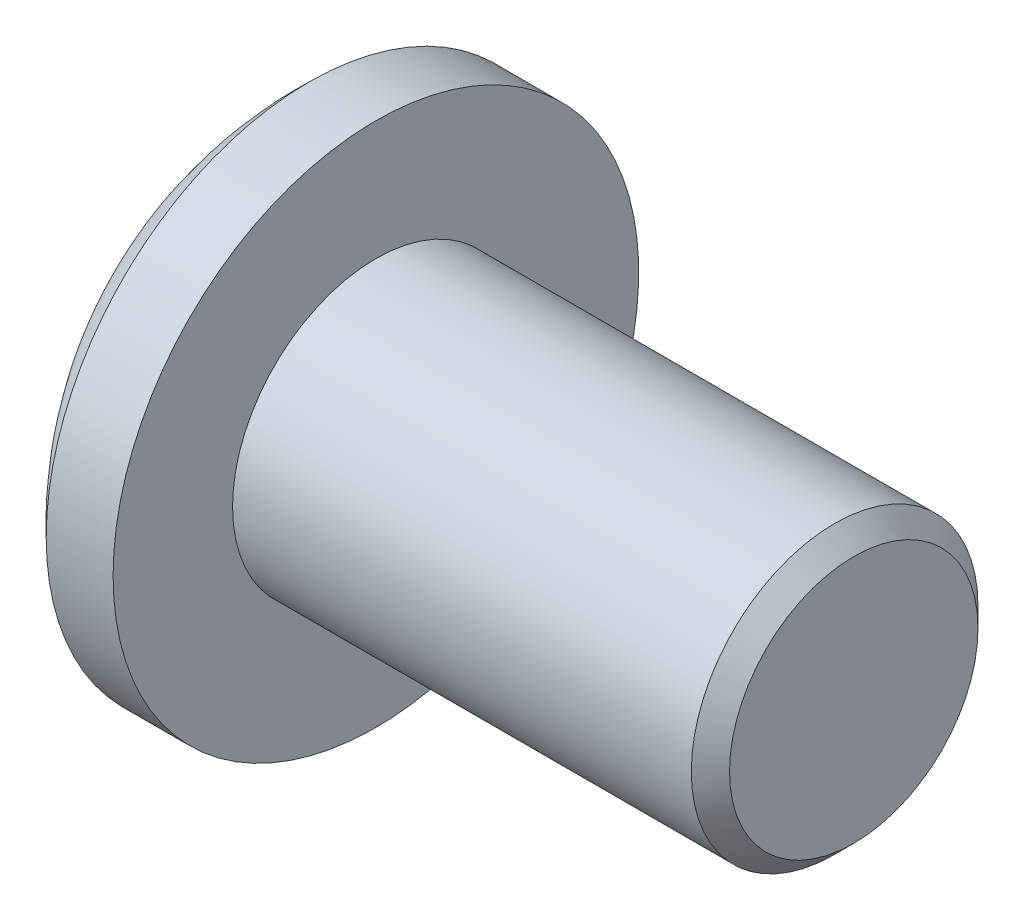
ISO-10303-21;
HEADER;
FILE_DESCRIPTION(('STEP AP214'),'2;1');
FILE_NAME('part.step','',(''),(''),'','','');
FILE_SCHEMA(('AUTOMOTIVE_DESIGN { 1 0 10303 214 1 1 1 1 }'));
ENDSEC;
DATA;
#1=APPLICATION_CONTEXT('core data for automotive mechanical design processes');
#2=APPLICATION_PROTOCOL_DEFINITION('international standard','automotive_design',2000,#1);
#3=PRODUCT_CONTEXT('',#1,'mechanical');
#4=PRODUCT('Part','Part','',(#3));
#5=PRODUCT_RELATED_PRODUCT_CATEGORY('part','',(#4));
#6=PRODUCT_DEFINITION_FORMATION('','',#4);
#7=PRODUCT_DEFINITION_CONTEXT('part definition',#1,'design');
#8=PRODUCT_DEFINITION('design','',#6,#7);
#9=PRODUCT_DEFINITION_SHAPE('','',#8);
#10=(LENGTH_UNIT() NAMED_UNIT(*) SI_UNIT(.MILLI.,.METRE.));
#11=(NAMED_UNIT(*) PLANE_ANGLE_UNIT() SI_UNIT($,.RADIAN.));
#12=(NAMED_UNIT(*) SI_UNIT($,.STERADIAN.) SOLID_ANGLE_UNIT());
#13=UNCERTAINTY_MEASURE_WITH_UNIT(LENGTH_MEASURE(1.E-05),#10,'distance_accuracy_value','');
#14=(GEOMETRIC_REPRESENTATION_CONTEXT(3) GLOBAL_UNCERTAINTY_ASSIGNED_CONTEXT((#13)) GLOBAL_UNIT_ASSIGNED_CONTEXT((#10,
#11,#12)) REPRESENTATION_CONTEXT('',''));
#15=CARTESIAN_POINT('',(0.,0.,0.));
#16=DIRECTION('',(0.,0.,1.));
#17=DIRECTION('',(1.,0.,0.));
#18=AXIS2_PLACEMENT_3D('',#15,#16,#17);
#19=CARTESIAN_POINT('',(0.,-0.35,0.35));
#20=DIRECTION('',(0.,-1.,0.));
#21=DIRECTION('',(0.,0.,-1.));
#22=AXIS2_PLACEMENT_3D('',#19,#20,#21);
#23=PLANE('',#22);
#24=CARTESIAN_POINT('',(1.31249982500017,-0.35,-0.000700000000000016));
#25=CARTESIAN_POINT('',(1.312556426158,-0.35,0.0291901757612279));
#26=CARTESIAN_POINT('',(1.31156711794547,-0.35,0.0590578749210361));
#27=CARTESIAN_POINT('',(1.30788247590197,-0.35,0.118636495399669));
#28=CARTESIAN_POINT('',(1.30519027348892,-0.35,0.148347603766359));
#29=CARTESIAN_POINT('',(1.29848919725521,-0.35,0.207556817473034));
#30=CARTESIAN_POINT('',(1.29448275105337,-0.35,0.237055213822397));
#31=CARTESIAN_POINT('',(1.28556389890639,-0.35,0.295928476326227));
#32=CARTESIAN_POINT('',(1.28065098534136,-0.35,0.32530326378573));
#33=CARTESIAN_POINT('',(1.26688604982366,-0.35,0.402698447303763));
#34=CARTESIAN_POINT('',(1.25752450056769,-0.35,0.450626795751266));
#35=CARTESIAN_POINT('',(1.23793898297709,-0.35,0.546308423997289));
#36=CARTESIAN_POINT('',(1.22771490332547,-0.35,0.594061680366267));
#37=CARTESIAN_POINT('',(1.19631892095972,-0.35,0.73717436804379));
#38=CARTESIAN_POINT('',(1.17442567862429,-0.35,0.8323745983494));
#39=CARTESIAN_POINT('',(1.12977441097477,-0.35,1.02317917286398));
#40=CARTESIAN_POINT('',(1.1070119333935,-0.35,1.11878245021183));
#41=CARTESIAN_POINT('',(1.07258702934453,-0.35,1.26208635516026));
#42=CARTESIAN_POINT('',(1.06106910824491,-0.35,1.30982148942342));
#43=CARTESIAN_POINT('',(1.03796108921691,-0.35,1.40527309922879));
#44=CARTESIAN_POINT('',(1.02637099299731,-0.35,1.45298957518453));
#45=CARTESIAN_POINT('',(1.01475653071726,-0.35,1.5007));
#46=B_SPLINE_CURVE_WITH_KNOTS('',3,(#24,#25,#26,#27,#28,#29,#30,#31,#32,#33,#34,#35,#36,#37,#38,
#39,#40,#41,#42,#43,#44,#45),.UNSPECIFIED.,.F.,.F.,(4,2,2,2,2,2,2,2,2,2,4),(0.,
0.0896175477774821,0.17907077684473,0.268359693248504,0.357698763866894,0.504183356378906,
0.650686883000155,0.943730994699917,1.2385586269609,1.38587362377094,1.53318514597955),.UNSPECIFIED.);
#47=CARTESIAN_POINT('',(1.27625631329236,-0.350000000000002,0.35));
#48=VERTEX_POINT('',#47);
#49=CARTESIAN_POINT('',(1.01492695498127,-0.35,1.5));
#50=VERTEX_POINT('',#49);
#51=EDGE_CURVE('E151',#48,#50,#46,.T.);
#52=ORIENTED_EDGE('',*,*,#51,.F.);
#53=DIRECTION('',(1.,0.,0.));
#54=VECTOR('',#53,1.);
#55=CARTESIAN_POINT('',(0.,-0.35,0.35));
#56=LINE('',#55,#54);
#57=CARTESIAN_POINT('',(0.032801009437841,-0.35,0.35));
#58=VERTEX_POINT('',#57);
#59=EDGE_CURVE('E258',#58,#48,#56,.T.);
#60=ORIENTED_EDGE('',*,*,#59,.F.);
#61=CARTESIAN_POINT('',(3.75104166666667,-0.35,0.));
#62=DIRECTION('',(0.,-1.,0.));
#63=DIRECTION('',(0.,0.,-1.));
#64=AXIS2_PLACEMENT_3D('',#61,#62,#63);
#65=CIRCLE('',#64,3.73467717280483);
#66=CARTESIAN_POINT('',(0.330835008426634,-0.35,1.5));
#67=VERTEX_POINT('',#66);
#68=EDGE_CURVE('E156',#67,#58,#65,.T.);
#69=ORIENTED_EDGE('',*,*,#68,.F.);
#70=DIRECTION('',(1.,0.,0.));
#71=VECTOR('',#70,1.);
#72=CARTESIAN_POINT('',(0.,-0.35,1.5));
#73=LINE('',#72,#71);
#74=EDGE_CURVE('E259',#67,#50,#73,.T.);
#75=ORIENTED_EDGE('',*,*,#74,.T.);
#76=EDGE_LOOP('',(#52,#60,#69,#75));
#77=FACE_BOUND('',#76,.T.);
#78=ADVANCED_FACE('F47',(#77),#23,.F.);
#79=CARTESIAN_POINT('',(0.,0.35,1.5));
#80=DIRECTION('',(0.,0.,1.));
#81=DIRECTION('',(1.,0.,0.));
#82=AXIS2_PLACEMENT_3D('',#79,#80,#81);
#83=PLANE('',#82);
#84=CARTESIAN_POINT('',(0.918132091381384,-1.21043252670426,1.5));
#85=CARTESIAN_POINT('',(0.930973543389138,-1.12856624331021,1.5));
#86=CARTESIAN_POINT('',(0.943068686502294,-1.04657060736441,1.5));
#87=CARTESIAN_POINT('',(0.965288556160192,-0.882270742182961,1.5));
#88=CARTESIAN_POINT('',(0.975412241366021,-0.799966373139374,1.5));
#89=CARTESIAN_POINT('',(0.993194036961851,-0.635111443336779,1.5));
#90=CARTESIAN_POINT('',(1.00085292549315,-0.552560968596644,1.5));
#91=CARTESIAN_POINT('',(1.01320708777964,-0.387240396022244,1.5));
#92=CARTESIAN_POINT('',(1.01790260324994,-0.304470316653786,1.5));
#93=CARTESIAN_POINT('',(1.02392263085181,-0.13967449866055,1.5));
#94=CARTESIAN_POINT('',(1.02528205273462,-0.0576500795542946,1.5));
#95=CARTESIAN_POINT('',(1.02461898626684,0.106386337497374,1.5));
#96=CARTESIAN_POINT('',(1.0225962945847,0.188398334399515,1.5));
#97=CARTESIAN_POINT('',(1.01168631710467,0.434137114600856,1.5));
#98=CARTESIAN_POINT('',(0.997960422545781,0.59766265669097,1.5));
#99=CARTESIAN_POINT('',(0.975303847621362,0.798130172100281,1.5));
#100=CARTESIAN_POINT('',(0.970810416971451,0.835652465096373,1.5));
#101=CARTESIAN_POINT('',(0.961378543942815,0.910639605057487,1.5));
#102=CARTESIAN_POINT('',(0.956440143534299,0.948104457102122,1.5));
#103=CARTESIAN_POINT('',(0.946148471494111,1.02307669175514,1.5));
#104=CARTESIAN_POINT('',(0.940794143495476,1.06058392731102,1.5));
#105=CARTESIAN_POINT('',(0.929723819718766,1.13554669433303,1.5));
#106=CARTESIAN_POINT('',(0.924007808483072,1.17300222351934,1.5));
#107=CARTESIAN_POINT('',(0.918132091381384,1.21043252670426,1.5));
#108=B_SPLINE_CURVE_WITH_KNOTS('',3,(#84,#85,#86,#87,#88,#89,#90,#91,#92,#93,#94,#95,#96,#97,
#98,#99,#100,#101,#102,#103,#104,#105,#106,#107),.UNSPECIFIED.,.F.,.F.,(4,2,2,2,2,2,2,2,2,2,2,
4),(0.,0.248616833237539,0.497364633665986,0.746033826698071,0.994682733768993,1.24071840364819,
1.48676886564296,1.9785825704132,2.09195618147225,2.20531911013537,2.31898001250494,
2.43264577579994),.UNSPECIFIED.);
#109=CARTESIAN_POINT('',(1.01492695498127,0.35,1.5));
#110=VERTEX_POINT('',#109);
#111=EDGE_CURVE('E63',#50,#110,#108,.T.);
#112=ORIENTED_EDGE('',*,*,#111,.F.);
#113=ORIENTED_EDGE('',*,*,#74,.F.);
#114=CARTESIAN_POINT('',(3.75104166666667,0.,1.5));
#115=DIRECTION('',(0.,0.,1.));
#116=DIRECTION('',(1.,0.,0.));
#117=AXIS2_PLACEMENT_3D('',#114,#115,#116);
#118=CIRCLE('',#117,3.43806829267097);
#119=CARTESIAN_POINT('',(0.330835008426634,0.35,1.5));
#120=VERTEX_POINT('',#119);
#121=EDGE_CURVE('E160',#120,#67,#118,.T.);
#122=ORIENTED_EDGE('',*,*,#121,.F.);
#123=DIRECTION('',(1.,0.,0.));
#124=VECTOR('',#123,1.);
#125=CARTESIAN_POINT('',(0.,0.35,1.5));
#126=LINE('',#125,#124);
#127=EDGE_CURVE('E297',#120,#110,#126,.T.);
#128=ORIENTED_EDGE('',*,*,#127,.T.);
#129=EDGE_LOOP('',(#112,#113,#122,#128));
#130=FACE_BOUND('',#129,.T.);
#131=ADVANCED_FACE('F174',(#130),#83,.F.);
#132=CARTESIAN_POINT('',(0.,0.35,0.35));
#133=DIRECTION('',(0.,1.,0.));
#134=DIRECTION('',(0.,0.,1.));
#135=AXIS2_PLACEMENT_3D('',#132,#133,#134);
#136=PLANE('',#135);
#137=CARTESIAN_POINT('',(1.01475653071726,0.35,1.5007));
#138=CARTESIAN_POINT('',(1.02984716381327,0.35,1.43869578309974));
#139=CARTESIAN_POINT('',(1.04490160914381,0.35,1.37668257615653));
#140=CARTESIAN_POINT('',(1.07487027517525,0.35,1.25264521214329));
#141=CARTESIAN_POINT('',(1.08978454296807,0.35,1.19062106644276));
#142=CARTESIAN_POINT('',(1.1193943761448,0.35,1.06661458848605));
#143=CARTESIAN_POINT('',(1.13409022448873,0.35,1.0046323238207));
#144=CARTESIAN_POINT('',(1.16316789341244,0.35,0.880570690843416));
#145=CARTESIAN_POINT('',(1.17754960250324,0.35,0.818491296174657));
#146=CARTESIAN_POINT('',(1.20578818411991,0.35,0.694029251182321));
#147=CARTESIAN_POINT('',(1.21964346027031,0.35,0.631646239510792));
#148=CARTESIAN_POINT('',(1.24627006810862,0.35,0.50669477744741));
#149=CARTESIAN_POINT('',(1.25904229607583,0.35,0.444126525622878));
#150=CARTESIAN_POINT('',(1.27639488909775,0.35,0.349839067986749));
#151=CARTESIAN_POINT('',(1.28188491971625,0.35,0.318290316131966));
#152=CARTESIAN_POINT('',(1.29190679538392,0.35,0.255053387681539));
#153=CARTESIAN_POINT('',(1.29643910699191,0.35,0.223365286686852));
#154=CARTESIAN_POINT('',(1.30406988834714,0.35,0.159709749626414));
#155=CARTESIAN_POINT('',(1.30716404858206,0.35,0.127741762767393));
#156=CARTESIAN_POINT('',(1.31141420028799,0.35,0.0636263192839079));
#157=CARTESIAN_POINT('',(1.3125668153707,0.35,0.0314786473573614));
#158=CARTESIAN_POINT('',(1.31249982500017,0.35,-0.000700000000000052));
#159=B_SPLINE_CURVE_WITH_KNOTS('',3,(#137,#138,#139,#140,#141,#142,#143,#144,#145,#146,#147,
#148,#149,#150,#151,#152,#153,#154,#155,#156,#157,#158),.UNSPECIFIED.,.F.,.F.,(4,2,2,2,2,2,2,2,
2,2,4),(0.,0.191442834244982,0.382818873885242,0.573920469621334,0.765088820705008,
0.956796887132839,1.14834472444967,1.24440382635218,1.3404160240232,1.43671410241299,
1.53317947297478),.UNSPECIFIED.);
#160=CARTESIAN_POINT('',(1.27625631329235,0.35,0.35));
#161=VERTEX_POINT('',#160);
#162=EDGE_CURVE('E71',#110,#161,#159,.T.);
#163=ORIENTED_EDGE('',*,*,#162,.F.);
#164=ORIENTED_EDGE('',*,*,#127,.F.);
#165=CARTESIAN_POINT('',(3.75104166666667,0.35,0.));
#166=DIRECTION('',(0.,1.,0.));
#167=DIRECTION('',(0.,0.,1.));
#168=AXIS2_PLACEMENT_3D('',#165,#166,#167);
#169=CIRCLE('',#168,3.73467717280483);
#170=CARTESIAN_POINT('',(0.032801009437841,0.35,0.35));
#171=VERTEX_POINT('',#170);
#172=EDGE_CURVE('E330',#171,#120,#169,.T.);
#173=ORIENTED_EDGE('',*,*,#172,.F.);
#174=DIRECTION('',(1.,0.,0.));
#175=VECTOR('',#174,1.);
#176=CARTESIAN_POINT('',(0.,0.35,0.35));
#177=LINE('',#176,#175);
#178=EDGE_CURVE('E333',#171,#161,#177,.T.);
#179=ORIENTED_EDGE('',*,*,#178,.T.);
#180=EDGE_LOOP('',(#163,#164,#173,#179));
#181=FACE_BOUND('',#180,.T.);
#182=ADVANCED_FACE('F332',(#181),#136,.F.);
#183=CARTESIAN_POINT('',(0.,1.5,0.35));
#184=DIRECTION('',(0.,0.,1.));
#185=DIRECTION('',(0.,-1.,0.));
#186=AXIS2_PLACEMENT_3D('',#183,#184,#185);
#187=PLANE('',#186);
#188=CARTESIAN_POINT('',(1.31249982500017,-0.000700000000000033,0.35));
#189=CARTESIAN_POINT('',(1.312556426158,0.0291901757612279,0.35));
#190=CARTESIAN_POINT('',(1.31156711794547,0.0590578749210361,0.35));
#191=CARTESIAN_POINT('',(1.30788247590197,0.118636495399669,0.35));
#192=CARTESIAN_POINT('',(1.30519027348892,0.148347603766359,0.35));
#193=CARTESIAN_POINT('',(1.29848919725521,0.207556817473034,0.35));
#194=CARTESIAN_POINT('',(1.29448275105337,0.237055213822397,0.35));
#195=CARTESIAN_POINT('',(1.28556389890639,0.295928476326227,0.35));
#196=CARTESIAN_POINT('',(1.28065098534136,0.32530326378573,0.35));
#197=CARTESIAN_POINT('',(1.26688604982366,0.402698447303763,0.35));
#198=CARTESIAN_POINT('',(1.25752450056769,0.450626795751266,0.35));
#199=CARTESIAN_POINT('',(1.23793898297709,0.546308423997289,0.35));
#200=CARTESIAN_POINT('',(1.22771490332547,0.594061680366267,0.35));
#201=CARTESIAN_POINT('',(1.19631892095972,0.73717436804379,0.35));
#202=CARTESIAN_POINT('',(1.17442567862429,0.8323745983494,0.35));
#203=CARTESIAN_POINT('',(1.12977441097477,1.02317917286399,0.35));
#204=CARTESIAN_POINT('',(1.1070119333935,1.11878245021183,0.35));
#205=CARTESIAN_POINT('',(1.07258702934453,1.26208635516026,0.35));
#206=CARTESIAN_POINT('',(1.06106910824491,1.30982148942342,0.35));
#207=CARTESIAN_POINT('',(1.03796108921691,1.40527309922879,0.35));
#208=CARTESIAN_POINT('',(1.02637099299731,1.45298957518453,0.35));
#209=CARTESIAN_POINT('',(1.01475653071726,1.5007,0.35));
#210=B_SPLINE_CURVE_WITH_KNOTS('',3,(#188,#189,#190,#191,#192,#193,#194,#195,#196,#197,#198,
#199,#200,#201,#202,#203,#204,#205,#206,#207,#208,#209),.UNSPECIFIED.,.F.,.F.,(4,2,2,2,2,2,2,2,
2,2,4),(0.,0.0896175477774821,0.17907077684473,0.268359693248504,0.357698763866894,
0.504183356378907,0.650686883000156,0.943730994699917,1.2385586269609,1.38587362377094,
1.53318514597955),.UNSPECIFIED.);
#211=CARTESIAN_POINT('',(1.01492695498127,1.5,0.35));
#212=VERTEX_POINT('',#211);
#213=EDGE_CURVE('E237',#161,#212,#210,.T.);
#214=ORIENTED_EDGE('',*,*,#213,.F.);
#215=ORIENTED_EDGE('',*,*,#178,.F.);
#216=CARTESIAN_POINT('',(3.75104166666667,0.,0.35));
#217=DIRECTION('',(0.,0.,1.));
#218=DIRECTION('',(0.,-1.,0.));
#219=AXIS2_PLACEMENT_3D('',#216,#217,#218);
#220=CIRCLE('',#219,3.73467717280483);
#221=CARTESIAN_POINT('',(0.330835008426635,1.5,0.35));
#222=VERTEX_POINT('',#221);
#223=EDGE_CURVE('E327',#222,#171,#220,.T.);
#224=ORIENTED_EDGE('',*,*,#223,.F.);
#225=DIRECTION('',(1.,0.,0.));
#226=VECTOR('',#225,1.);
#227=CARTESIAN_POINT('',(0.,1.5,0.35));
#228=LINE('',#227,#226);
#229=EDGE_CURVE('E339',#222,#212,#228,.T.);
#230=ORIENTED_EDGE('',*,*,#229,.T.);
#231=EDGE_LOOP('',(#214,#215,#224,#230));
#232=FACE_BOUND('',#231,.T.);
#233=ADVANCED_FACE('F335',(#232),#187,.F.);
#234=CARTESIAN_POINT('',(0.,1.5,-0.35));
#235=DIRECTION('',(0.,1.,0.));
#236=DIRECTION('',(0.,0.,1.));
#237=AXIS2_PLACEMENT_3D('',#234,#235,#236);
#238=PLANE('',#237);
#239=CARTESIAN_POINT('',(0.918132091381384,1.5,1.21043252670426));
#240=CARTESIAN_POINT('',(0.930973543389138,1.5,1.12856624331021));
#241=CARTESIAN_POINT('',(0.943068686502294,1.5,1.04657060736441));
#242=CARTESIAN_POINT('',(0.965288556160192,1.5,0.88227074218296));
#243=CARTESIAN_POINT('',(0.975412241366021,1.5,0.799966373139374));
#244=CARTESIAN_POINT('',(0.993194036961851,1.5,0.635111443336779));
#245=CARTESIAN_POINT('',(1.00085292549315,1.5,0.552560968596644));
#246=CARTESIAN_POINT('',(1.01320708777964,1.5,0.387240396022243));
#247=CARTESIAN_POINT('',(1.01790260324994,1.5,0.304470316653786));
#248=CARTESIAN_POINT('',(1.02392263085181,1.5,0.13967449866055));
#249=CARTESIAN_POINT('',(1.02528205273461,1.5,0.0576500795542946));
#250=CARTESIAN_POINT('',(1.02461898626684,1.5,-0.106386337497374));
#251=CARTESIAN_POINT('',(1.0225962945847,1.5,-0.188398334399515));
#252=CARTESIAN_POINT('',(1.01168631710467,1.5,-0.434137114600856));
#253=CARTESIAN_POINT('',(0.997960422545781,1.5,-0.59766265669097));
#254=CARTESIAN_POINT('',(0.975303847621362,1.5,-0.798130172100281));
#255=CARTESIAN_POINT('',(0.970810416971451,1.5,-0.835652465096373));
#256=CARTESIAN_POINT('',(0.961378543942814,1.5,-0.910639605057487));
#257=CARTESIAN_POINT('',(0.956440143534298,1.5,-0.948104457102122));
#258=CARTESIAN_POINT('',(0.94614847149411,1.5,-1.02307669175514));
#259=CARTESIAN_POINT('',(0.940794143495476,1.5,-1.06058392731102));
#260=CARTESIAN_POINT('',(0.929723819718766,1.5,-1.13554669433303));
#261=CARTESIAN_POINT('',(0.924007808483072,1.5,-1.17300222351934));
#262=CARTESIAN_POINT('',(0.918132091381384,1.5,-1.21043252670426));
#263=B_SPLINE_CURVE_WITH_KNOTS('',3,(#239,#240,#241,#242,#243,#244,#245,#246,#247,#248,#249,
#250,#251,#252,#253,#254,#255,#256,#257,#258,#259,#260,#261,#262),.UNSPECIFIED.,.F.,.F.,(4,2,2,
2,2,2,2,2,2,2,2,4),(0.,0.24861683323754,0.497364633665986,0.746033826698072,0.994682733768993,
1.24071840364819,1.48676886564296,1.9785825704132,2.09195618147225,2.20531911013537,
2.31898001250494,2.43264577579994),.UNSPECIFIED.);
#264=CARTESIAN_POINT('',(1.01492695498127,1.5,-0.35));
#265=VERTEX_POINT('',#264);
#266=EDGE_CURVE('E229',#212,#265,#263,.T.);
#267=ORIENTED_EDGE('',*,*,#266,.F.);
#268=ORIENTED_EDGE('',*,*,#229,.F.);
#269=CARTESIAN_POINT('',(3.75104166666667,1.5,0.));
#270=DIRECTION('',(0.,1.,0.));
#271=DIRECTION('',(0.,0.,1.));
#272=AXIS2_PLACEMENT_3D('',#269,#270,#271);
#273=CIRCLE('',#272,3.43806829267096);
#274=CARTESIAN_POINT('',(0.330835008426635,1.5,-0.35));
#275=VERTEX_POINT('',#274);
#276=EDGE_CURVE('E324',#275,#222,#273,.T.);
#277=ORIENTED_EDGE('',*,*,#276,.F.);
#278=DIRECTION('',(1.,0.,0.));
#279=VECTOR('',#278,1.);
#280=CARTESIAN_POINT('',(0.,1.5,-0.35));
#281=LINE('',#280,#279);
#282=EDGE_CURVE('E341',#275,#265,#281,.T.);
#283=ORIENTED_EDGE('',*,*,#282,.T.);
#284=EDGE_LOOP('',(#267,#268,#277,#283));
#285=FACE_BOUND('',#284,.T.);
#286=ADVANCED_FACE('F395',(#285),#238,.F.);
#287=CARTESIAN_POINT('',(0.,1.5,-0.35));
#288=DIRECTION('',(0.,0.,-1.));
#289=DIRECTION('',(0.,1.,0.));
#290=AXIS2_PLACEMENT_3D('',#287,#288,#289);
#291=PLANE('',#290);
#292=CARTESIAN_POINT('',(1.01475653071726,1.5007,-0.35));
#293=CARTESIAN_POINT('',(1.02984716381327,1.43869578309974,-0.35));
#294=CARTESIAN_POINT('',(1.04490160914381,1.37668257615653,-0.35));
#295=CARTESIAN_POINT('',(1.07487027517525,1.25264521214329,-0.35));
#296=CARTESIAN_POINT('',(1.08978454296807,1.19062106644276,-0.35));
#297=CARTESIAN_POINT('',(1.1193943761448,1.06661458848605,-0.35));
#298=CARTESIAN_POINT('',(1.13409022448873,1.0046323238207,-0.35));
#299=CARTESIAN_POINT('',(1.16316789341244,0.880570690843416,-0.35));
#300=CARTESIAN_POINT('',(1.17754960250324,0.818491296174657,-0.35));
#301=CARTESIAN_POINT('',(1.20578818411991,0.694029251182321,-0.35));
#302=CARTESIAN_POINT('',(1.21964346027031,0.631646239510792,-0.35));
#303=CARTESIAN_POINT('',(1.24627006810862,0.50669477744741,-0.35));
#304=CARTESIAN_POINT('',(1.25904229607583,0.444126525622878,-0.35));
#305=CARTESIAN_POINT('',(1.27639488909775,0.349839067986749,-0.35));
#306=CARTESIAN_POINT('',(1.28188491971625,0.318290316131966,-0.35));
#307=CARTESIAN_POINT('',(1.29190679538392,0.255053387681539,-0.35));
#308=CARTESIAN_POINT('',(1.29643910699191,0.223365286686852,-0.35));
#309=CARTESIAN_POINT('',(1.30406988834714,0.159709749626414,-0.35));
#310=CARTESIAN_POINT('',(1.30716404858206,0.127741762767393,-0.35));
#311=CARTESIAN_POINT('',(1.31141420028799,0.0636263192839078,-0.35));
#312=CARTESIAN_POINT('',(1.3125668153707,0.0314786473573612,-0.35));
#313=CARTESIAN_POINT('',(1.31249982500017,-0.000700000000000115,-0.35));
#314=B_SPLINE_CURVE_WITH_KNOTS('',3,(#292,#293,#294,#295,#296,#297,#298,#299,#300,#301,#302,
#303,#304,#305,#306,#307,#308,#309,#310,#311,#312,#313),.UNSPECIFIED.,.F.,.F.,(4,2,2,2,2,2,2,2,
2,2,4),(0.,0.191442834244982,0.382818873885242,0.573920469621334,0.765088820705009,
0.956796887132839,1.14834472444967,1.24440382635218,1.3404160240232,1.43671410241299,
1.53317947297478),.UNSPECIFIED.);
#315=CARTESIAN_POINT('',(1.27625631329235,0.35,-0.35));
#316=VERTEX_POINT('',#315);
#317=EDGE_CURVE('E221',#265,#316,#314,.T.);
#318=ORIENTED_EDGE('',*,*,#317,.F.);
#319=ORIENTED_EDGE('',*,*,#282,.F.);
#320=CARTESIAN_POINT('',(3.75104166666667,0.,-0.35));
#321=DIRECTION('',(0.,0.,-1.));
#322=DIRECTION('',(0.,1.,0.));
#323=AXIS2_PLACEMENT_3D('',#320,#321,#322);
#324=CIRCLE('',#323,3.73467717280482);
#325=CARTESIAN_POINT('',(0.032801009437841,0.35,-0.35));
#326=VERTEX_POINT('',#325);
#327=EDGE_CURVE('E321',#326,#275,#324,.T.);
#328=ORIENTED_EDGE('',*,*,#327,.F.);
#329=DIRECTION('',(1.,0.,0.));
#330=VECTOR('',#329,1.);
#331=CARTESIAN_POINT('',(0.,0.35,-0.35));
#332=LINE('',#331,#330);
#333=EDGE_CURVE('E346',#326,#316,#332,.T.);
#334=ORIENTED_EDGE('',*,*,#333,.T.);
#335=EDGE_LOOP('',(#318,#319,#328,#334));
#336=FACE_BOUND('',#335,.T.);
#337=ADVANCED_FACE('F391',(#336),#291,.F.);
#338=CARTESIAN_POINT('',(0.,0.35,-1.5));
#339=DIRECTION('',(0.,1.,0.));
#340=DIRECTION('',(0.,0.,1.));
#341=AXIS2_PLACEMENT_3D('',#338,#339,#340);
#342=PLANE('',#341);
#343=CARTESIAN_POINT('',(1.31249982500017,0.35,0.000700000000000049));
#344=CARTESIAN_POINT('',(1.312556426158,0.35,-0.0291901757612279));
#345=CARTESIAN_POINT('',(1.31156711794547,0.35,-0.0590578749210361));
#346=CARTESIAN_POINT('',(1.30788247590197,0.35,-0.118636495399669));
#347=CARTESIAN_POINT('',(1.30519027348892,0.35,-0.148347603766359));
#348=CARTESIAN_POINT('',(1.29848919725521,0.35,-0.207556817473034));
#349=CARTESIAN_POINT('',(1.29448275105337,0.35,-0.237055213822397));
#350=CARTESIAN_POINT('',(1.28556389890639,0.35,-0.295928476326227));
#351=CARTESIAN_POINT('',(1.28065098534136,0.35,-0.32530326378573));
#352=CARTESIAN_POINT('',(1.26688604982366,0.35,-0.402698447303763));
#353=CARTESIAN_POINT('',(1.25752450056769,0.35,-0.450626795751266));
#354=CARTESIAN_POINT('',(1.23793898297709,0.35,-0.546308423997289));
#355=CARTESIAN_POINT('',(1.22771490332547,0.35,-0.594061680366268));
#356=CARTESIAN_POINT('',(1.19631892095972,0.35,-0.73717436804379));
#357=CARTESIAN_POINT('',(1.17442567862429,0.35,-0.832374598349401));
#358=CARTESIAN_POINT('',(1.12977441097477,0.35,-1.02317917286399));
#359=CARTESIAN_POINT('',(1.1070119333935,0.35,-1.11878245021183));
#360=CARTESIAN_POINT('',(1.07258702934453,0.35,-1.26208635516027));
#361=CARTESIAN_POINT('',(1.06106910824491,0.35,-1.30982148942343));
#362=CARTESIAN_POINT('',(1.03796108921691,0.35,-1.40527309922879));
#363=CARTESIAN_POINT('',(1.02637099299731,0.35,-1.45298957518453));
#364=CARTESIAN_POINT('',(1.01475653071726,0.35,-1.5007));
#365=B_SPLINE_CURVE_WITH_KNOTS('',3,(#343,#344,#345,#346,#347,#348,#349,#350,#351,#352,#353,
#354,#355,#356,#357,#358,#359,#360,#361,#362,#363,#364),.UNSPECIFIED.,.F.,.F.,(4,2,2,2,2,2,2,2,
2,2,4),(0.,0.0896175477774821,0.17907077684473,0.268359693248504,0.357698763866894,
0.504183356378907,0.650686883000156,0.943730994699918,1.2385586269609,1.38587362377094,
1.53318514597956),.UNSPECIFIED.);
#366=CARTESIAN_POINT('',(1.01492695498127,0.35,-1.5));
#367=VERTEX_POINT('',#366);
#368=EDGE_CURVE('E213',#316,#367,#365,.T.);
#369=ORIENTED_EDGE('',*,*,#368,.F.);
#370=ORIENTED_EDGE('',*,*,#333,.F.);
#371=CARTESIAN_POINT('',(3.75104166666667,0.35,0.));
#372=DIRECTION('',(0.,1.,0.));
#373=DIRECTION('',(0.,0.,1.));
#374=AXIS2_PLACEMENT_3D('',#371,#372,#373);
#375=CIRCLE('',#374,3.73467717280483);
#376=CARTESIAN_POINT('',(0.330835008426635,0.35,-1.5));
#377=VERTEX_POINT('',#376);
#378=EDGE_CURVE('E318',#377,#326,#375,.T.);
#379=ORIENTED_EDGE('',*,*,#378,.F.);
#380=DIRECTION('',(1.,0.,0.));
#381=VECTOR('',#380,1.);
#382=CARTESIAN_POINT('',(0.,0.35,-1.5));
#383=LINE('',#382,#381);
#384=EDGE_CURVE('E349',#377,#367,#383,.T.);
#385=ORIENTED_EDGE('',*,*,#384,.T.);
#386=EDGE_LOOP('',(#369,#370,#379,#385));
#387=FACE_BOUND('',#386,.T.);
#388=ADVANCED_FACE('F387',(#387),#342,.F.);
#389=CARTESIAN_POINT('',(0.,0.35,-1.5));
#390=DIRECTION('',(0.,0.,-1.));
#391=DIRECTION('',(-1.,0.,0.));
#392=AXIS2_PLACEMENT_3D('',#389,#390,#391);
#393=PLANE('',#392);
#394=CARTESIAN_POINT('',(0.918132091381384,1.21043252670426,-1.5));
#395=CARTESIAN_POINT('',(0.930973543389138,1.12856624331021,-1.5));
#396=CARTESIAN_POINT('',(0.943068686502294,1.04657060736441,-1.5));
#397=CARTESIAN_POINT('',(0.965288556160191,0.88227074218296,-1.5));
#398=CARTESIAN_POINT('',(0.97541224136602,0.799966373139373,-1.5));
#399=CARTESIAN_POINT('',(0.993194036961851,0.635111443336778,-1.5));
#400=CARTESIAN_POINT('',(1.00085292549315,0.552560968596643,-1.5));
#401=CARTESIAN_POINT('',(1.01320708777964,0.387240396022243,-1.5));
#402=CARTESIAN_POINT('',(1.01790260324994,0.304470316653785,-1.5));
#403=CARTESIAN_POINT('',(1.02392263085181,0.13967449866055,-1.5));
#404=CARTESIAN_POINT('',(1.02528205273461,0.057650079554294,-1.5));
#405=CARTESIAN_POINT('',(1.02461898626684,-0.106386337497374,-1.5));
#406=CARTESIAN_POINT('',(1.0225962945847,-0.188398334399516,-1.5));
#407=CARTESIAN_POINT('',(1.01168631710467,-0.434137114600857,-1.5));
#408=CARTESIAN_POINT('',(0.99796042254578,-0.597662656690971,-1.5));
#409=CARTESIAN_POINT('',(0.975303847621361,-0.798130172100282,-1.5));
#410=CARTESIAN_POINT('',(0.970810416971451,-0.835652465096375,-1.5));
#411=CARTESIAN_POINT('',(0.961378543942814,-0.910639605057488,-1.5));
#412=CARTESIAN_POINT('',(0.956440143534298,-0.948104457102123,-1.5));
#413=CARTESIAN_POINT('',(0.94614847149411,-1.02307669175514,-1.5));
#414=CARTESIAN_POINT('',(0.940794143495476,-1.06058392731102,-1.5));
#415=CARTESIAN_POINT('',(0.929723819718766,-1.13554669433303,-1.5));
#416=CARTESIAN_POINT('',(0.924007808483071,-1.17300222351934,-1.5));
#417=CARTESIAN_POINT('',(0.918132091381384,-1.21043252670426,-1.5));
#418=B_SPLINE_CURVE_WITH_KNOTS('',3,(#394,#395,#396,#397,#398,#399,#400,#401,#402,#403,#404,
#405,#406,#407,#408,#409,#410,#411,#412,#413,#414,#415,#416,#417),.UNSPECIFIED.,.F.,.F.,(4,2,2,
2,2,2,2,2,2,2,2,4),(0.,0.24861683323754,0.497364633665987,0.746033826698072,0.994682733768994,
1.24071840364819,1.48676886564296,1.9785825704132,2.09195618147225,2.20531911013537,
2.31898001250494,2.43264577579994),.UNSPECIFIED.);
#419=CARTESIAN_POINT('',(1.01492695498127,-0.35,-1.5));
#420=VERTEX_POINT('',#419);
#421=EDGE_CURVE('E205',#367,#420,#418,.T.);
#422=ORIENTED_EDGE('',*,*,#421,.F.);
#423=ORIENTED_EDGE('',*,*,#384,.F.);
#424=CARTESIAN_POINT('',(3.75104166666667,0.,-1.5));
#425=DIRECTION('',(0.,0.,-1.));
#426=DIRECTION('',(-1.,0.,0.));
#427=AXIS2_PLACEMENT_3D('',#424,#425,#426);
#428=CIRCLE('',#427,3.43806829267096);
#429=CARTESIAN_POINT('',(0.330835008426635,-0.35,-1.5));
#430=VERTEX_POINT('',#429);
#431=EDGE_CURVE('E315',#430,#377,#428,.T.);
#432=ORIENTED_EDGE('',*,*,#431,.F.);
#433=DIRECTION('',(1.,0.,0.));
#434=VECTOR('',#433,1.);
#435=CARTESIAN_POINT('',(0.,-0.35,-1.5));
#436=LINE('',#435,#434);
#437=EDGE_CURVE('E352',#430,#420,#436,.T.);
#438=ORIENTED_EDGE('',*,*,#437,.T.);
#439=EDGE_LOOP('',(#422,#423,#432,#438));
#440=FACE_BOUND('',#439,.T.);
#441=ADVANCED_FACE('F384',(#440),#393,.F.);
#442=CARTESIAN_POINT('',(0.,-0.35,-1.5));
#443=DIRECTION('',(0.,-1.,0.));
#444=DIRECTION('',(0.,0.,-1.));
#445=AXIS2_PLACEMENT_3D('',#442,#443,#444);
#446=PLANE('',#445);
#447=CARTESIAN_POINT('',(1.01475653071726,-0.35,-1.5007));
#448=CARTESIAN_POINT('',(1.02984716381327,-0.35,-1.43869578309974));
#449=CARTESIAN_POINT('',(1.04490160914381,-0.35,-1.37668257615653));
#450=CARTESIAN_POINT('',(1.07487027517525,-0.35,-1.25264521214329));
#451=CARTESIAN_POINT('',(1.08978454296807,-0.35,-1.19062106644276));
#452=CARTESIAN_POINT('',(1.1193943761448,-0.35,-1.06661458848605));
#453=CARTESIAN_POINT('',(1.13409022448873,-0.35,-1.0046323238207));
#454=CARTESIAN_POINT('',(1.16316789341244,-0.35,-0.880570690843417));
#455=CARTESIAN_POINT('',(1.17754960250324,-0.35,-0.818491296174658));
#456=CARTESIAN_POINT('',(1.20578818411991,-0.35,-0.694029251182322));
#457=CARTESIAN_POINT('',(1.21964346027031,-0.35,-0.631646239510792));
#458=CARTESIAN_POINT('',(1.24627006810862,-0.35,-0.506694777447411));
#459=CARTESIAN_POINT('',(1.25904229607583,-0.35,-0.444126525622878));
#460=CARTESIAN_POINT('',(1.27639488909775,-0.35,-0.349839067986749));
#461=CARTESIAN_POINT('',(1.28188491971625,-0.35,-0.318290316131966));
#462=CARTESIAN_POINT('',(1.29190679538392,-0.35,-0.255053387681539));
#463=CARTESIAN_POINT('',(1.29643910699191,-0.35,-0.223365286686852));
#464=CARTESIAN_POINT('',(1.30406988834714,-0.35,-0.159709749626414));
#465=CARTESIAN_POINT('',(1.30716404858206,-0.35,-0.127741762767393));
#466=CARTESIAN_POINT('',(1.31141420028799,-0.35,-0.063626319283908));
#467=CARTESIAN_POINT('',(1.3125668153707,-0.35,-0.0314786473573614));
#468=CARTESIAN_POINT('',(1.31249982500017,-0.35,0.000699999999999887));
#469=B_SPLINE_CURVE_WITH_KNOTS('',3,(#447,#448,#449,#450,#451,#452,#453,#454,#455,#456,#457,
#458,#459,#460,#461,#462,#463,#464,#465,#466,#467,#468),.UNSPECIFIED.,.F.,.F.,(4,2,2,2,2,2,2,2,
2,2,4),(0.,0.191442834244982,0.382818873885242,0.573920469621334,0.765088820705009,
0.95679688713284,1.14834472444967,1.24440382635218,1.3404160240232,1.43671410241299,
1.53317947297478),.UNSPECIFIED.);
#470=CARTESIAN_POINT('',(1.27625631329235,-0.35,-0.35));
#471=VERTEX_POINT('',#470);
#472=EDGE_CURVE('E197',#420,#471,#469,.T.);
#473=ORIENTED_EDGE('',*,*,#472,.F.);
#474=ORIENTED_EDGE('',*,*,#437,.F.);
#475=CARTESIAN_POINT('',(3.75104166666667,-0.35,0.));
#476=DIRECTION('',(0.,-1.,0.));
#477=DIRECTION('',(0.,0.,-1.));
#478=AXIS2_PLACEMENT_3D('',#475,#476,#477);
#479=CIRCLE('',#478,3.73467717280483);
#480=CARTESIAN_POINT('',(0.032801009437841,-0.35,-0.35));
#481=VERTEX_POINT('',#480);
#482=EDGE_CURVE('E312',#481,#430,#479,.T.);
#483=ORIENTED_EDGE('',*,*,#482,.F.);
#484=DIRECTION('',(1.,0.,0.));
#485=VECTOR('',#484,1.);
#486=CARTESIAN_POINT('',(0.,-0.35,-0.35));
#487=LINE('',#486,#485);
#488=EDGE_CURVE('E355',#481,#471,#487,.T.);
#489=ORIENTED_EDGE('',*,*,#488,.T.);
#490=EDGE_LOOP('',(#473,#474,#483,#489));
#491=FACE_BOUND('',#490,.T.);
#492=ADVANCED_FACE('F374',(#491),#446,.F.);
#493=CARTESIAN_POINT('',(0.,-0.35,-0.35));
#494=DIRECTION('',(0.,0.,-1.));
#495=DIRECTION('',(0.,1.,0.));
#496=AXIS2_PLACEMENT_3D('',#493,#494,#495);
#497=PLANE('',#496);
#498=CARTESIAN_POINT('',(1.31249982500017,0.000700000000000049,-0.35));
#499=CARTESIAN_POINT('',(1.312556426158,-0.0291901757612279,-0.35));
#500=CARTESIAN_POINT('',(1.31156711794547,-0.059057874921036,-0.35));
#501=CARTESIAN_POINT('',(1.30788247590197,-0.118636495399669,-0.35));
#502=CARTESIAN_POINT('',(1.30519027348892,-0.148347603766359,-0.35));
#503=CARTESIAN_POINT('',(1.29848919725521,-0.207556817473034,-0.35));
#504=CARTESIAN_POINT('',(1.29448275105337,-0.237055213822397,-0.35));
#505=CARTESIAN_POINT('',(1.28556389890639,-0.295928476326227,-0.35));
#506=CARTESIAN_POINT('',(1.28065098534136,-0.32530326378573,-0.35));
#507=CARTESIAN_POINT('',(1.26688604982366,-0.402698447303763,-0.35));
#508=CARTESIAN_POINT('',(1.25752450056769,-0.450626795751266,-0.35));
#509=CARTESIAN_POINT('',(1.23793898297709,-0.546308423997289,-0.35));
#510=CARTESIAN_POINT('',(1.22771490332547,-0.594061680366267,-0.35));
#511=CARTESIAN_POINT('',(1.19631892095972,-0.73717436804379,-0.35));
#512=CARTESIAN_POINT('',(1.17442567862429,-0.8323745983494,-0.35));
#513=CARTESIAN_POINT('',(1.12977441097477,-1.02317917286399,-0.35));
#514=CARTESIAN_POINT('',(1.1070119333935,-1.11878245021183,-0.35));
#515=CARTESIAN_POINT('',(1.07258702934453,-1.26208635516027,-0.35));
#516=CARTESIAN_POINT('',(1.06106910824491,-1.30982148942342,-0.35));
#517=CARTESIAN_POINT('',(1.03796108921691,-1.40527309922879,-0.35));
#518=CARTESIAN_POINT('',(1.02637099299731,-1.45298957518453,-0.35));
#519=CARTESIAN_POINT('',(1.01475653071726,-1.5007,-0.35));
#520=B_SPLINE_CURVE_WITH_KNOTS('',3,(#498,#499,#500,#501,#502,#503,#504,#505,#506,#507,#508,
#509,#510,#511,#512,#513,#514,#515,#516,#517,#518,#519),.UNSPECIFIED.,.F.,.F.,(4,2,2,2,2,2,2,2,
2,2,4),(0.,0.0896175477774821,0.17907077684473,0.268359693248504,0.357698763866894,
0.504183356378907,0.650686883000156,0.943730994699917,1.2385586269609,1.38587362377094,
1.53318514597955),.UNSPECIFIED.);
#521=CARTESIAN_POINT('',(1.01492695498127,-1.5,-0.35));
#522=VERTEX_POINT('',#521);
#523=EDGE_CURVE('E189',#471,#522,#520,.T.);
#524=ORIENTED_EDGE('',*,*,#523,.F.);
#525=ORIENTED_EDGE('',*,*,#488,.F.);
#526=CARTESIAN_POINT('',(3.75104166666667,0.,-0.35));
#527=DIRECTION('',(0.,0.,-1.));
#528=DIRECTION('',(0.,1.,0.));
#529=AXIS2_PLACEMENT_3D('',#526,#527,#528);
#530=CIRCLE('',#529,3.73467717280483);
#531=CARTESIAN_POINT('',(0.330835008426635,-1.5,-0.35));
#532=VERTEX_POINT('',#531);
#533=EDGE_CURVE('E309',#532,#481,#530,.T.);
#534=ORIENTED_EDGE('',*,*,#533,.F.);
#535=DIRECTION('',(1.,0.,0.));
#536=VECTOR('',#535,1.);
#537=CARTESIAN_POINT('',(0.,-1.5,-0.35));
#538=LINE('',#537,#536);
#539=EDGE_CURVE('E358',#532,#522,#538,.T.);
#540=ORIENTED_EDGE('',*,*,#539,.T.);
#541=EDGE_LOOP('',(#524,#525,#534,#540));
#542=FACE_BOUND('',#541,.T.);
#543=ADVANCED_FACE('F371',(#542),#497,.F.);
#544=CARTESIAN_POINT('',(0.,-1.5,-0.35));
#545=DIRECTION('',(0.,-1.,0.));
#546=DIRECTION('',(0.,0.,-1.));
#547=AXIS2_PLACEMENT_3D('',#544,#545,#546);
#548=PLANE('',#547);
#549=CARTESIAN_POINT('',(0.918132091381384,-1.5,-1.21043252670426));
#550=CARTESIAN_POINT('',(0.930973543389138,-1.5,-1.12856624331021));
#551=CARTESIAN_POINT('',(0.943068686502294,-1.5,-1.04657060736441));
#552=CARTESIAN_POINT('',(0.965288556160192,-1.5,-0.882270742182961));
#553=CARTESIAN_POINT('',(0.975412241366021,-1.5,-0.799966373139374));
#554=CARTESIAN_POINT('',(0.993194036961851,-1.5,-0.635111443336779));
#555=CARTESIAN_POINT('',(1.00085292549315,-1.5,-0.552560968596644));
#556=CARTESIAN_POINT('',(1.01320708777964,-1.5,-0.387240396022243));
#557=CARTESIAN_POINT('',(1.01790260324994,-1.5,-0.304470316653785));
#558=CARTESIAN_POINT('',(1.02392263085181,-1.5,-0.13967449866055));
#559=CARTESIAN_POINT('',(1.02528205273461,-1.5,-0.0576500795542942));
#560=CARTESIAN_POINT('',(1.02461898626684,-1.5,0.106386337497374));
#561=CARTESIAN_POINT('',(1.0225962945847,-1.5,0.188398334399516));
#562=CARTESIAN_POINT('',(1.01168631710467,-1.5,0.434137114600856));
#563=CARTESIAN_POINT('',(0.99796042254578,-1.5,0.597662656690971));
#564=CARTESIAN_POINT('',(0.975303847621362,-1.5,0.798130172100282));
#565=CARTESIAN_POINT('',(0.970810416971451,-1.5,0.835652465096374));
#566=CARTESIAN_POINT('',(0.961378543942815,-1.5,0.910639605057488));
#567=CARTESIAN_POINT('',(0.956440143534298,-1.5,0.948104457102123));
#568=CARTESIAN_POINT('',(0.94614847149411,-1.5,1.02307669175514));
#569=CARTESIAN_POINT('',(0.940794143495476,-1.5,1.06058392731102));
#570=CARTESIAN_POINT('',(0.929723819718766,-1.5,1.13554669433303));
#571=CARTESIAN_POINT('',(0.924007808483072,-1.5,1.17300222351934));
#572=CARTESIAN_POINT('',(0.918132091381384,-1.5,1.21043252670426));
#573=B_SPLINE_CURVE_WITH_KNOTS('',3,(#549,#550,#551,#552,#553,#554,#555,#556,#557,#558,#559,
#560,#561,#562,#563,#564,#565,#566,#567,#568,#569,#570,#571,#572),.UNSPECIFIED.,.F.,.F.,(4,2,2,
2,2,2,2,2,2,2,2,4),(0.,0.248616833237539,0.497364633665986,0.746033826698072,0.994682733768994,
1.24071840364819,1.48676886564296,1.9785825704132,2.09195618147225,2.20531911013537,
2.31898001250494,2.43264577579994),.UNSPECIFIED.);
#574=CARTESIAN_POINT('',(1.01492695498127,-1.5,0.35));
#575=VERTEX_POINT('',#574);
#576=EDGE_CURVE('E153',#522,#575,#573,.T.);
#577=ORIENTED_EDGE('',*,*,#576,.F.);
#578=ORIENTED_EDGE('',*,*,#539,.F.);
#579=CARTESIAN_POINT('',(3.75104166666667,-1.5,0.));
#580=DIRECTION('',(0.,-1.,0.));
#581=DIRECTION('',(0.,0.,-1.));
#582=AXIS2_PLACEMENT_3D('',#579,#580,#581);
#583=CIRCLE('',#582,3.43806829267096);
#584=CARTESIAN_POINT('',(0.330835008426635,-1.5,0.35));
#585=VERTEX_POINT('',#584);
#586=EDGE_CURVE('E306',#585,#532,#583,.T.);
#587=ORIENTED_EDGE('',*,*,#586,.F.);
#588=DIRECTION('',(1.,0.,0.));
#589=VECTOR('',#588,1.);
#590=CARTESIAN_POINT('',(0.,-1.5,0.35));
#591=LINE('',#590,#589);
#592=EDGE_CURVE('E360',#585,#575,#591,.T.);
#593=ORIENTED_EDGE('',*,*,#592,.T.);
#594=EDGE_LOOP('',(#577,#578,#587,#593));
#595=FACE_BOUND('',#594,.T.);
#596=ADVANCED_FACE('F285',(#595),#548,.F.);
#597=CARTESIAN_POINT('',(0.,-0.35,0.35));
#598=DIRECTION('',(0.,0.,1.));
#599=DIRECTION('',(0.,-1.,0.));
#600=AXIS2_PLACEMENT_3D('',#597,#598,#599);
#601=PLANE('',#600);
#602=CARTESIAN_POINT('',(1.01475653071726,-1.5007,0.35));
#603=CARTESIAN_POINT('',(1.02984716381327,-1.43869578309974,0.35));
#604=CARTESIAN_POINT('',(1.04490160914381,-1.37668257615653,0.35));
#605=CARTESIAN_POINT('',(1.07487027517525,-1.25264521214329,0.35));
#606=CARTESIAN_POINT('',(1.08978454296807,-1.19062106644276,0.35));
#607=CARTESIAN_POINT('',(1.1193943761448,-1.06661458848605,0.35));
#608=CARTESIAN_POINT('',(1.13409022448873,-1.0046323238207,0.35));
#609=CARTESIAN_POINT('',(1.16316789341244,-0.880570690843416,0.35));
#610=CARTESIAN_POINT('',(1.17754960250324,-0.818491296174657,0.35));
#611=CARTESIAN_POINT('',(1.20578818411991,-0.694029251182321,0.35));
#612=CARTESIAN_POINT('',(1.21964346027031,-0.631646239510792,0.35));
#613=CARTESIAN_POINT('',(1.24627006810862,-0.50669477744741,0.35));
#614=CARTESIAN_POINT('',(1.25904229607583,-0.444126525622878,0.35));
#615=CARTESIAN_POINT('',(1.27639488909775,-0.349839067986749,0.35));
#616=CARTESIAN_POINT('',(1.28188491971625,-0.318290316131966,0.35));
#617=CARTESIAN_POINT('',(1.29190679538392,-0.255053387681539,0.35));
#618=CARTESIAN_POINT('',(1.29643910699191,-0.223365286686852,0.35));
#619=CARTESIAN_POINT('',(1.30406988834714,-0.159709749626414,0.35));
#620=CARTESIAN_POINT('',(1.30716404858206,-0.127741762767393,0.35));
#621=CARTESIAN_POINT('',(1.31141420028799,-0.0636263192839079,0.35));
#622=CARTESIAN_POINT('',(1.3125668153707,-0.0314786473573613,0.35));
#623=CARTESIAN_POINT('',(1.31249982500017,0.000700000000000104,0.35));
#624=B_SPLINE_CURVE_WITH_KNOTS('',3,(#602,#603,#604,#605,#606,#607,#608,#609,#610,#611,#612,
#613,#614,#615,#616,#617,#618,#619,#620,#621,#622,#623),.UNSPECIFIED.,.F.,.F.,(4,2,2,2,2,2,2,2,
2,2,4),(0.,0.191442834244982,0.382818873885242,0.573920469621334,0.765088820705009,
0.956796887132839,1.14834472444967,1.24440382635218,1.3404160240232,1.43671410241299,
1.53317947297478),.UNSPECIFIED.);
#625=EDGE_CURVE('E149',#575,#48,#624,.T.);
#626=ORIENTED_EDGE('',*,*,#625,.F.);
#627=ORIENTED_EDGE('',*,*,#592,.F.);
#628=CARTESIAN_POINT('',(3.75104166666667,0.,0.35));
#629=DIRECTION('',(0.,0.,1.));
#630=DIRECTION('',(0.,-1.,0.));
#631=AXIS2_PLACEMENT_3D('',#628,#629,#630);
#632=CIRCLE('',#631,3.73467717280483);
#633=EDGE_CURVE('E303',#58,#585,#632,.T.);
#634=ORIENTED_EDGE('',*,*,#633,.F.);
#635=ORIENTED_EDGE('',*,*,#59,.T.);
#636=EDGE_LOOP('',(#626,#627,#634,#635));
#637=FACE_BOUND('',#636,.T.);
#638=ADVANCED_FACE('F168',(#637),#601,.F.);
#639=CARTESIAN_POINT('',(3.75104166666667,0.,0.));
#640=DIRECTION('',(-1.,0.,0.));
#641=DIRECTION('',(0.,1.,0.));
#642=AXIS2_PLACEMENT_3D('',#639,#640,#641);
#643=SPHERICAL_SURFACE('',#642,3.75104166666667);
#644=ORIENTED_EDGE('',*,*,#121,.T.);
#645=ORIENTED_EDGE('',*,*,#68,.T.);
#646=ORIENTED_EDGE('',*,*,#633,.T.);
#647=ORIENTED_EDGE('',*,*,#586,.T.);
#648=ORIENTED_EDGE('',*,*,#533,.T.);
#649=ORIENTED_EDGE('',*,*,#482,.T.);
#650=ORIENTED_EDGE('',*,*,#431,.T.);
#651=ORIENTED_EDGE('',*,*,#378,.T.);
#652=ORIENTED_EDGE('',*,*,#327,.T.);
#653=ORIENTED_EDGE('',*,*,#276,.T.);
#654=ORIENTED_EDGE('',*,*,#223,.T.);
#655=ORIENTED_EDGE('',*,*,#172,.T.);
#656=EDGE_LOOP('',(#644,#645,#646,#647,#648,#649,#650,#651,#652,#653,#654,#655));
#657=FACE_BOUND('',#656,.T.);
#658=CARTESIAN_POINT('',(1.2,0.,0.));
#659=DIRECTION('',(-1.,0.,0.));
#660=DIRECTION('',(0.,0.,1.));
#661=AXIS2_PLACEMENT_3D('',#658,#659,#660);
#662=CIRCLE('',#661,2.75);
#663=CARTESIAN_POINT('',(1.2,0.,2.75));
#664=VERTEX_POINT('',#663);
#665=EDGE_CURVE('E291',#664,#664,#662,.T.);
#666=ORIENTED_EDGE('',*,*,#665,.T.);
#667=EDGE_LOOP('',(#666));
#668=FACE_BOUND('',#667,.T.);
#669=ADVANCED_FACE('F278',(#657,#668),#643,.T.);
#670=CARTESIAN_POINT('',(6.9,1.5,0.));
#671=DIRECTION('',(-1.,0.,0.));
#672=DIRECTION('',(0.,0.,1.));
#673=AXIS2_PLACEMENT_3D('',#670,#671,#672);
#674=PLANE('',#673);
#675=CARTESIAN_POINT('',(6.9,0.,0.));
#676=DIRECTION('',(-1.,0.,0.));
#677=DIRECTION('',(0.,0.,1.));
#678=AXIS2_PLACEMENT_3D('',#675,#676,#677);
#679=CIRCLE('',#678,1.3);
#680=CARTESIAN_POINT('',(6.9,0.,1.3));
#681=VERTEX_POINT('',#680);
#682=EDGE_CURVE('E11',#681,#681,#679,.F.);
#683=ORIENTED_EDGE('',*,*,#682,.T.);
#684=EDGE_LOOP('',(#683));
#685=FACE_BOUND('',#684,.T.);
#686=ADVANCED_FACE('F275',(#685),#674,.F.);
#687=CARTESIAN_POINT('',(0.,0.,0.));
#688=DIRECTION('',(-1.,0.,0.));
#689=DIRECTION('',(0.,0.,1.));
#690=AXIS2_PLACEMENT_3D('',#687,#688,#689);
#691=CYLINDRICAL_SURFACE('',#690,1.5);
#692=CARTESIAN_POINT('',(6.7,0.,0.));
#693=DIRECTION('',(-1.,0.,0.));
#694=DIRECTION('',(0.,0.,1.));
#695=AXIS2_PLACEMENT_3D('',#692,#693,#694);
#696=CIRCLE('',#695,1.5);
#697=CARTESIAN_POINT('',(6.7,0.,1.5));
#698=VERTEX_POINT('',#697);
#699=EDGE_CURVE('E56',#698,#698,#696,.T.);
#700=ORIENTED_EDGE('',*,*,#699,.T.);
#701=EDGE_LOOP('',(#700));
#702=FACE_BOUND('',#701,.T.);
#703=CARTESIAN_POINT('',(1.9,0.,0.));
#704=DIRECTION('',(-1.,0.,0.));
#705=DIRECTION('',(0.,0.,1.));
#706=AXIS2_PLACEMENT_3D('',#703,#704,#705);
#707=CIRCLE('',#706,1.5);
#708=CARTESIAN_POINT('',(1.9,0.,1.5));
#709=VERTEX_POINT('',#708);
#710=EDGE_CURVE('E295',#709,#709,#707,.T.);
#711=ORIENTED_EDGE('',*,*,#710,.F.);
#712=EDGE_LOOP('',(#711));
#713=FACE_BOUND('',#712,.T.);
#714=ADVANCED_FACE('F271',(#702,#713),#691,.T.);
#715=CARTESIAN_POINT('',(1.9,2.75,0.));
#716=DIRECTION('',(-1.,0.,0.));
#717=DIRECTION('',(0.,0.,1.));
#718=AXIS2_PLACEMENT_3D('',#715,#716,#717);
#719=PLANE('',#718);
#720=CARTESIAN_POINT('',(1.9,0.,0.));
#721=DIRECTION('',(-1.,0.,0.));
#722=DIRECTION('',(0.,0.,1.));
#723=AXIS2_PLACEMENT_3D('',#720,#721,#722);
#724=CIRCLE('',#723,2.75);
#725=CARTESIAN_POINT('',(1.9,0.,2.75));
#726=VERTEX_POINT('',#725);
#727=EDGE_CURVE('E292',#726,#726,#724,.T.);
#728=ORIENTED_EDGE('',*,*,#727,.F.);
#729=EDGE_LOOP('',(#728));
#730=FACE_BOUND('',#729,.T.);
#731=ORIENTED_EDGE('',*,*,#710,.T.);
#732=EDGE_LOOP('',(#731));
#733=FACE_BOUND('',#732,.T.);
#734=ADVANCED_FACE('F267',(#730,#733),#719,.F.);
#735=CARTESIAN_POINT('',(0.,0.,0.));
#736=DIRECTION('',(-1.,0.,0.));
#737=DIRECTION('',(0.,0.,1.));
#738=AXIS2_PLACEMENT_3D('',#735,#736,#737);
#739=CYLINDRICAL_SURFACE('',#738,2.75);
#740=ORIENTED_EDGE('',*,*,#665,.F.);
#741=EDGE_LOOP('',(#740));
#742=FACE_BOUND('',#741,.T.);
#743=ORIENTED_EDGE('',*,*,#727,.T.);
#744=EDGE_LOOP('',(#743));
#745=FACE_BOUND('',#744,.T.);
#746=ADVANCED_FACE('F144',(#742,#745),#739,.T.);
#747=CARTESIAN_POINT('',(0.9,0.,0.));
#748=DIRECTION('',(-1.,0.,0.));
#749=DIRECTION('',(0.,0.,1.));
#750=AXIS2_PLACEMENT_3D('',#747,#748,#749);
#751=CONICAL_SURFACE('',#750,2.,1.32581766366803);
#752=CARTESIAN_POINT('',(1.4,0.,0.));
#753=VERTEX_POINT('',#752);
#754=VERTEX_LOOP('',#753);
#755=FACE_BOUND('',#754,.T.);
#756=ORIENTED_EDGE('',*,*,#625,.T.);
#757=ORIENTED_EDGE('',*,*,#51,.T.);
#758=ORIENTED_EDGE('',*,*,#111,.T.);
#759=ORIENTED_EDGE('',*,*,#162,.T.);
#760=ORIENTED_EDGE('',*,*,#213,.T.);
#761=ORIENTED_EDGE('',*,*,#266,.T.);
#762=ORIENTED_EDGE('',*,*,#317,.T.);
#763=ORIENTED_EDGE('',*,*,#368,.T.);
#764=ORIENTED_EDGE('',*,*,#421,.T.);
#765=ORIENTED_EDGE('',*,*,#472,.T.);
#766=ORIENTED_EDGE('',*,*,#523,.T.);
#767=ORIENTED_EDGE('',*,*,#576,.T.);
#768=EDGE_LOOP('',(#756,#757,#758,#759,#760,#761,#762,#763,#764,#765,#766,#767));
#769=FACE_BOUND('',#768,.T.);
#770=ADVANCED_FACE('F141',(#755,#769),#751,.F.);
#771=CARTESIAN_POINT('',(6.7,0.,0.));
#772=DIRECTION('',(-1.,0.,0.));
#773=DIRECTION('',(0.,0.,1.));
#774=AXIS2_PLACEMENT_3D('',#771,#772,#773);
#775=CONICAL_SURFACE('',#774,1.5,0.785398163397454);
#776=ORIENTED_EDGE('',*,*,#682,.F.);
#777=EDGE_LOOP('',(#776));
#778=FACE_BOUND('',#777,.T.);
#779=ORIENTED_EDGE('',*,*,#699,.F.);
#780=EDGE_LOOP('',(#779));
#781=FACE_BOUND('',#780,.T.);
#782=ADVANCED_FACE('F50',(#778,#781),#775,.T.);
#783=CLOSED_SHELL('',(#78,#131,#182,#233,#286,#337,#388,#441,#492,#543,#596,#638,#669,#686,#714,
#734,#746,#770,#782));
#784=MANIFOLD_SOLID_BREP('B2',#783);
#785=ADVANCED_BREP_SHAPE_REPRESENTATION('',(#18,#784),#14);
#786=SHAPE_DEFINITION_REPRESENTATION(#9,#785);
ENDSEC;
END-ISO-10303-21;
